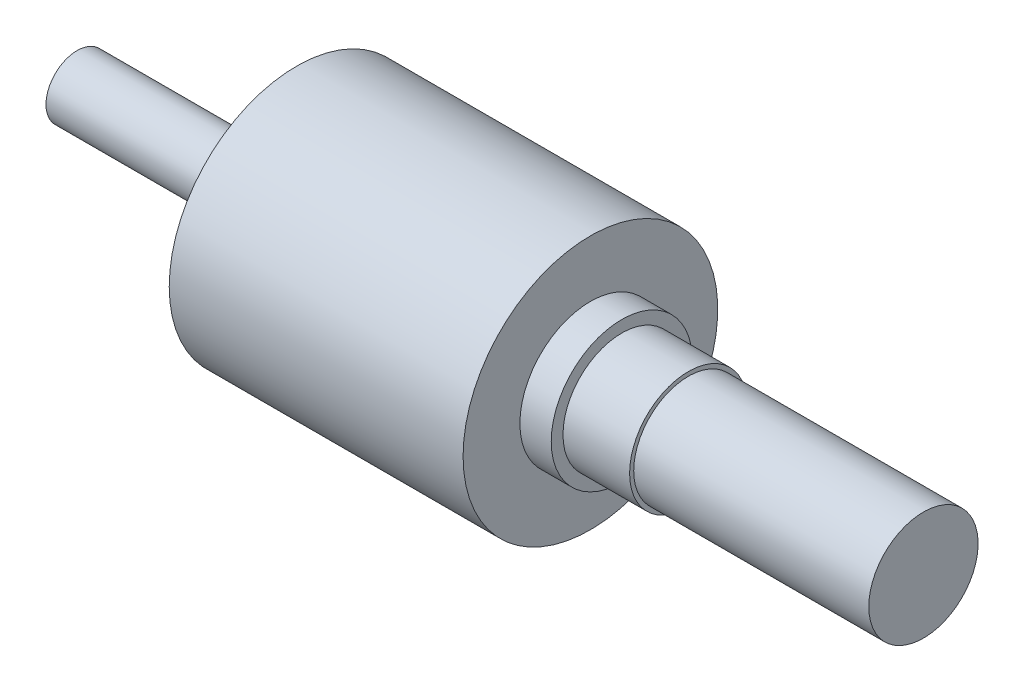
ISO-10303-21;
HEADER;
FILE_DESCRIPTION(('STEP AP214'),'2;1');
FILE_NAME('part.step','',(''),(''),'','','');
FILE_SCHEMA(('AUTOMOTIVE_DESIGN { 1 0 10303 214 1 1 1 1 }'));
ENDSEC;
DATA;
#1=APPLICATION_CONTEXT('core data for automotive mechanical design processes');
#2=APPLICATION_PROTOCOL_DEFINITION('international standard','automotive_design',2000,#1);
#3=PRODUCT_CONTEXT('',#1,'mechanical');
#4=PRODUCT('Part','Part','',(#3));
#5=PRODUCT_RELATED_PRODUCT_CATEGORY('part','',(#4));
#6=PRODUCT_DEFINITION_FORMATION('','',#4);
#7=PRODUCT_DEFINITION_CONTEXT('part definition',#1,'design');
#8=PRODUCT_DEFINITION('design','',#6,#7);
#9=PRODUCT_DEFINITION_SHAPE('','',#8);
#10=(LENGTH_UNIT() NAMED_UNIT(*) SI_UNIT(.MILLI.,.METRE.));
#11=(NAMED_UNIT(*) PLANE_ANGLE_UNIT() SI_UNIT($,.RADIAN.));
#12=(NAMED_UNIT(*) SI_UNIT($,.STERADIAN.) SOLID_ANGLE_UNIT());
#13=UNCERTAINTY_MEASURE_WITH_UNIT(LENGTH_MEASURE(1.E-05),#10,'distance_accuracy_value','');
#14=(GEOMETRIC_REPRESENTATION_CONTEXT(3) GLOBAL_UNCERTAINTY_ASSIGNED_CONTEXT((#13)) GLOBAL_UNIT_ASSIGNED_CONTEXT((#10,
#11,#12)) REPRESENTATION_CONTEXT('',''));
#15=CARTESIAN_POINT('',(0.,0.,0.));
#16=DIRECTION('',(0.,0.,1.));
#17=DIRECTION('',(1.,0.,0.));
#18=AXIS2_PLACEMENT_3D('',#15,#16,#17);
#19=CARTESIAN_POINT('',(0.,0.,0.));
#20=DIRECTION('',(1.,0.,0.));
#21=DIRECTION('',(0.,0.,-1.));
#22=AXIS2_PLACEMENT_3D('',#19,#20,#21);
#23=PLANE('',#22);
#24=CARTESIAN_POINT('',(0.,0.,0.));
#25=DIRECTION('',(-1.,0.,0.));
#26=DIRECTION('',(0.,0.,1.));
#27=AXIS2_PLACEMENT_3D('',#24,#25,#26);
#28=CIRCLE('',#27,3.975);
#29=CARTESIAN_POINT('',(0.,0.,3.975));
#30=VERTEX_POINT('',#29);
#31=EDGE_CURVE('E10',#30,#30,#28,.T.);
#32=ORIENTED_EDGE('',*,*,#31,.T.);
#33=EDGE_LOOP('',(#32));
#34=FACE_BOUND('',#33,.T.);
#35=ADVANCED_FACE('F38',(#34),#23,.F.);
#36=CARTESIAN_POINT('',(0.,0.,0.));
#37=DIRECTION('',(-1.,0.,0.));
#38=DIRECTION('',(0.,0.,1.));
#39=AXIS2_PLACEMENT_3D('',#36,#37,#38);
#40=CYLINDRICAL_SURFACE('',#39,3.975);
#41=ORIENTED_EDGE('',*,*,#31,.F.);
#42=EDGE_LOOP('',(#41));
#43=FACE_BOUND('',#42,.T.);
#44=CARTESIAN_POINT('',(24.,0.,0.));
#45=DIRECTION('',(-1.,0.,0.));
#46=DIRECTION('',(0.,0.,1.));
#47=AXIS2_PLACEMENT_3D('',#44,#45,#46);
#48=CIRCLE('',#47,3.975);
#49=CARTESIAN_POINT('',(24.,0.,3.975));
#50=VERTEX_POINT('',#49);
#51=EDGE_CURVE('E45',#50,#50,#48,.T.);
#52=ORIENTED_EDGE('',*,*,#51,.T.);
#53=EDGE_LOOP('',(#52));
#54=FACE_BOUND('',#53,.T.);
#55=ADVANCED_FACE('F112',(#43,#54),#40,.T.);
#56=CARTESIAN_POINT('',(24.,3.975,0.));
#57=DIRECTION('',(1.,0.,0.));
#58=DIRECTION('',(0.,0.,-1.));
#59=AXIS2_PLACEMENT_3D('',#56,#57,#58);
#60=PLANE('',#59);
#61=ORIENTED_EDGE('',*,*,#51,.F.);
#62=EDGE_LOOP('',(#61));
#63=FACE_BOUND('',#62,.T.);
#64=CARTESIAN_POINT('',(24.,0.,0.));
#65=DIRECTION('',(-1.,0.,0.));
#66=DIRECTION('',(0.,0.,1.));
#67=AXIS2_PLACEMENT_3D('',#64,#65,#66);
#68=CIRCLE('',#67,6.);
#69=CARTESIAN_POINT('',(24.,0.,6.));
#70=VERTEX_POINT('',#69);
#71=EDGE_CURVE('E52',#70,#70,#68,.T.);
#72=ORIENTED_EDGE('',*,*,#71,.T.);
#73=EDGE_LOOP('',(#72));
#74=FACE_BOUND('',#73,.T.);
#75=ADVANCED_FACE('F116',(#63,#74),#60,.F.);
#76=CARTESIAN_POINT('',(0.,0.,0.));
#77=DIRECTION('',(-1.,0.,0.));
#78=DIRECTION('',(0.,0.,1.));
#79=AXIS2_PLACEMENT_3D('',#76,#77,#78);
#80=CYLINDRICAL_SURFACE('',#79,6.);
#81=ORIENTED_EDGE('',*,*,#71,.F.);
#82=EDGE_LOOP('',(#81));
#83=FACE_BOUND('',#82,.T.);
#84=CARTESIAN_POINT('',(28.,0.,0.));
#85=DIRECTION('',(-1.,0.,0.));
#86=DIRECTION('',(0.,0.,1.));
#87=AXIS2_PLACEMENT_3D('',#84,#85,#86);
#88=CIRCLE('',#87,6.);
#89=CARTESIAN_POINT('',(28.,0.,6.));
#90=VERTEX_POINT('',#89);
#91=EDGE_CURVE('E59',#90,#90,#88,.T.);
#92=ORIENTED_EDGE('',*,*,#91,.T.);
#93=EDGE_LOOP('',(#92));
#94=FACE_BOUND('',#93,.T.);
#95=ADVANCED_FACE('F121',(#83,#94),#80,.T.);
#96=CARTESIAN_POINT('',(28.,6.,0.));
#97=DIRECTION('',(1.,0.,0.));
#98=DIRECTION('',(0.,0.,-1.));
#99=AXIS2_PLACEMENT_3D('',#96,#97,#98);
#100=PLANE('',#99);
#101=ORIENTED_EDGE('',*,*,#91,.F.);
#102=EDGE_LOOP('',(#101));
#103=FACE_BOUND('',#102,.T.);
#104=CARTESIAN_POINT('',(28.,0.,0.));
#105=DIRECTION('',(-1.,0.,0.));
#106=DIRECTION('',(0.,0.,1.));
#107=AXIS2_PLACEMENT_3D('',#104,#105,#106);
#108=CIRCLE('',#107,16.25);
#109=CARTESIAN_POINT('',(28.,0.,16.25));
#110=VERTEX_POINT('',#109);
#111=EDGE_CURVE('E65',#110,#110,#108,.T.);
#112=ORIENTED_EDGE('',*,*,#111,.T.);
#113=EDGE_LOOP('',(#112));
#114=FACE_BOUND('',#113,.T.);
#115=ADVANCED_FACE('F127',(#103,#114),#100,.F.);
#116=CARTESIAN_POINT('',(0.,0.,0.));
#117=DIRECTION('',(-1.,0.,0.));
#118=DIRECTION('',(0.,0.,1.));
#119=AXIS2_PLACEMENT_3D('',#116,#117,#118);
#120=CYLINDRICAL_SURFACE('',#119,16.25);
#121=ORIENTED_EDGE('',*,*,#111,.F.);
#122=EDGE_LOOP('',(#121));
#123=FACE_BOUND('',#122,.T.);
#124=CARTESIAN_POINT('',(65.5,0.,0.));
#125=DIRECTION('',(-1.,0.,0.));
#126=DIRECTION('',(0.,0.,1.));
#127=AXIS2_PLACEMENT_3D('',#124,#125,#126);
#128=CIRCLE('',#127,16.25);
#129=CARTESIAN_POINT('',(65.5,0.,16.25));
#130=VERTEX_POINT('',#129);
#131=EDGE_CURVE('E69',#130,#130,#128,.T.);
#132=ORIENTED_EDGE('',*,*,#131,.T.);
#133=EDGE_LOOP('',(#132));
#134=FACE_BOUND('',#133,.T.);
#135=ADVANCED_FACE('F131',(#123,#134),#120,.T.);
#136=CARTESIAN_POINT('',(65.5,16.25,0.));
#137=DIRECTION('',(-1.,0.,0.));
#138=DIRECTION('',(0.,0.,1.));
#139=AXIS2_PLACEMENT_3D('',#136,#137,#138);
#140=PLANE('',#139);
#141=ORIENTED_EDGE('',*,*,#131,.F.);
#142=EDGE_LOOP('',(#141));
#143=FACE_BOUND('',#142,.T.);
#144=CARTESIAN_POINT('',(65.5,0.,0.));
#145=DIRECTION('',(-1.,0.,0.));
#146=DIRECTION('',(0.,0.,1.));
#147=AXIS2_PLACEMENT_3D('',#144,#145,#146);
#148=CIRCLE('',#147,9.);
#149=CARTESIAN_POINT('',(65.5,0.,9.));
#150=VERTEX_POINT('',#149);
#151=EDGE_CURVE('E73',#150,#150,#148,.T.);
#152=ORIENTED_EDGE('',*,*,#151,.T.);
#153=EDGE_LOOP('',(#152));
#154=FACE_BOUND('',#153,.T.);
#155=ADVANCED_FACE('F135',(#143,#154),#140,.F.);
#156=CARTESIAN_POINT('',(0.,0.,0.));
#157=DIRECTION('',(-1.,0.,0.));
#158=DIRECTION('',(0.,0.,1.));
#159=AXIS2_PLACEMENT_3D('',#156,#157,#158);
#160=CYLINDRICAL_SURFACE('',#159,9.);
#161=ORIENTED_EDGE('',*,*,#151,.F.);
#162=EDGE_LOOP('',(#161));
#163=FACE_BOUND('',#162,.T.);
#164=CARTESIAN_POINT('',(69.5,0.,0.));
#165=DIRECTION('',(-1.,0.,0.));
#166=DIRECTION('',(0.,0.,1.));
#167=AXIS2_PLACEMENT_3D('',#164,#165,#166);
#168=CIRCLE('',#167,9.);
#169=CARTESIAN_POINT('',(69.5,0.,9.));
#170=VERTEX_POINT('',#169);
#171=EDGE_CURVE('E77',#170,#170,#168,.T.);
#172=ORIENTED_EDGE('',*,*,#171,.T.);
#173=EDGE_LOOP('',(#172));
#174=FACE_BOUND('',#173,.T.);
#175=ADVANCED_FACE('F139',(#163,#174),#160,.T.);
#176=CARTESIAN_POINT('',(69.5,9.,0.));
#177=DIRECTION('',(-1.,0.,0.));
#178=DIRECTION('',(0.,0.,1.));
#179=AXIS2_PLACEMENT_3D('',#176,#177,#178);
#180=PLANE('',#179);
#181=ORIENTED_EDGE('',*,*,#171,.F.);
#182=EDGE_LOOP('',(#181));
#183=FACE_BOUND('',#182,.T.);
#184=CARTESIAN_POINT('',(69.5,0.,0.));
#185=DIRECTION('',(-1.,0.,0.));
#186=DIRECTION('',(0.,0.,1.));
#187=AXIS2_PLACEMENT_3D('',#184,#185,#186);
#188=CIRCLE('',#187,7.5);
#189=CARTESIAN_POINT('',(69.5,0.,7.5));
#190=VERTEX_POINT('',#189);
#191=EDGE_CURVE('E81',#190,#190,#188,.T.);
#192=ORIENTED_EDGE('',*,*,#191,.T.);
#193=EDGE_LOOP('',(#192));
#194=FACE_BOUND('',#193,.T.);
#195=ADVANCED_FACE('F143',(#183,#194),#180,.F.);
#196=CARTESIAN_POINT('',(0.,0.,0.));
#197=DIRECTION('',(-1.,0.,0.));
#198=DIRECTION('',(0.,0.,1.));
#199=AXIS2_PLACEMENT_3D('',#196,#197,#198);
#200=CYLINDRICAL_SURFACE('',#199,7.5);
#201=ORIENTED_EDGE('',*,*,#191,.F.);
#202=EDGE_LOOP('',(#201));
#203=FACE_BOUND('',#202,.T.);
#204=CARTESIAN_POINT('',(78.,0.,0.));
#205=DIRECTION('',(-1.,0.,0.));
#206=DIRECTION('',(0.,0.,1.));
#207=AXIS2_PLACEMENT_3D('',#204,#205,#206);
#208=CIRCLE('',#207,7.5);
#209=CARTESIAN_POINT('',(78.,0.,7.5));
#210=VERTEX_POINT('',#209);
#211=EDGE_CURVE('E85',#210,#210,#208,.T.);
#212=ORIENTED_EDGE('',*,*,#211,.T.);
#213=EDGE_LOOP('',(#212));
#214=FACE_BOUND('',#213,.T.);
#215=ADVANCED_FACE('F147',(#203,#214),#200,.T.);
#216=CARTESIAN_POINT('',(78.,7.5,0.));
#217=DIRECTION('',(-1.,0.,0.));
#218=DIRECTION('',(0.,0.,1.));
#219=AXIS2_PLACEMENT_3D('',#216,#217,#218);
#220=PLANE('',#219);
#221=ORIENTED_EDGE('',*,*,#211,.F.);
#222=EDGE_LOOP('',(#221));
#223=FACE_BOUND('',#222,.T.);
#224=CARTESIAN_POINT('',(78.,0.,0.));
#225=DIRECTION('',(-1.,0.,0.));
#226=DIRECTION('',(0.,0.,1.));
#227=AXIS2_PLACEMENT_3D('',#224,#225,#226);
#228=CIRCLE('',#227,6.975);
#229=CARTESIAN_POINT('',(78.,0.,6.975));
#230=VERTEX_POINT('',#229);
#231=EDGE_CURVE('E89',#230,#230,#228,.T.);
#232=ORIENTED_EDGE('',*,*,#231,.T.);
#233=EDGE_LOOP('',(#232));
#234=FACE_BOUND('',#233,.T.);
#235=ADVANCED_FACE('F108',(#223,#234),#220,.F.);
#236=CARTESIAN_POINT('',(0.,0.,0.));
#237=DIRECTION('',(-1.,0.,0.));
#238=DIRECTION('',(0.,0.,1.));
#239=AXIS2_PLACEMENT_3D('',#236,#237,#238);
#240=CYLINDRICAL_SURFACE('',#239,6.975);
#241=ORIENTED_EDGE('',*,*,#231,.F.);
#242=EDGE_LOOP('',(#241));
#243=FACE_BOUND('',#242,.T.);
#244=CARTESIAN_POINT('',(108.,0.,0.));
#245=DIRECTION('',(-1.,0.,0.));
#246=DIRECTION('',(0.,0.,1.));
#247=AXIS2_PLACEMENT_3D('',#244,#245,#246);
#248=CIRCLE('',#247,6.975);
#249=CARTESIAN_POINT('',(108.,0.,6.975));
#250=VERTEX_POINT('',#249);
#251=EDGE_CURVE('E93',#250,#250,#248,.T.);
#252=ORIENTED_EDGE('',*,*,#251,.T.);
#253=EDGE_LOOP('',(#252));
#254=FACE_BOUND('',#253,.T.);
#255=ADVANCED_FACE('F100',(#243,#254),#240,.T.);
#256=CARTESIAN_POINT('',(108.,6.975,0.));
#257=DIRECTION('',(-1.,0.,0.));
#258=DIRECTION('',(0.,0.,1.));
#259=AXIS2_PLACEMENT_3D('',#256,#257,#258);
#260=PLANE('',#259);
#261=ORIENTED_EDGE('',*,*,#251,.F.);
#262=EDGE_LOOP('',(#261));
#263=FACE_BOUND('',#262,.T.);
#264=ADVANCED_FACE('F102',(#263),#260,.F.);
#265=CLOSED_SHELL('',(#35,#55,#75,#95,#115,#135,#155,#175,#195,#215,#235,#255,#264));
#266=MANIFOLD_SOLID_BREP('B2',#265);
#267=ADVANCED_BREP_SHAPE_REPRESENTATION('',(#18,#266),#14);
#268=SHAPE_DEFINITION_REPRESENTATION(#9,#267);
ENDSEC;
END-ISO-10303-21;
